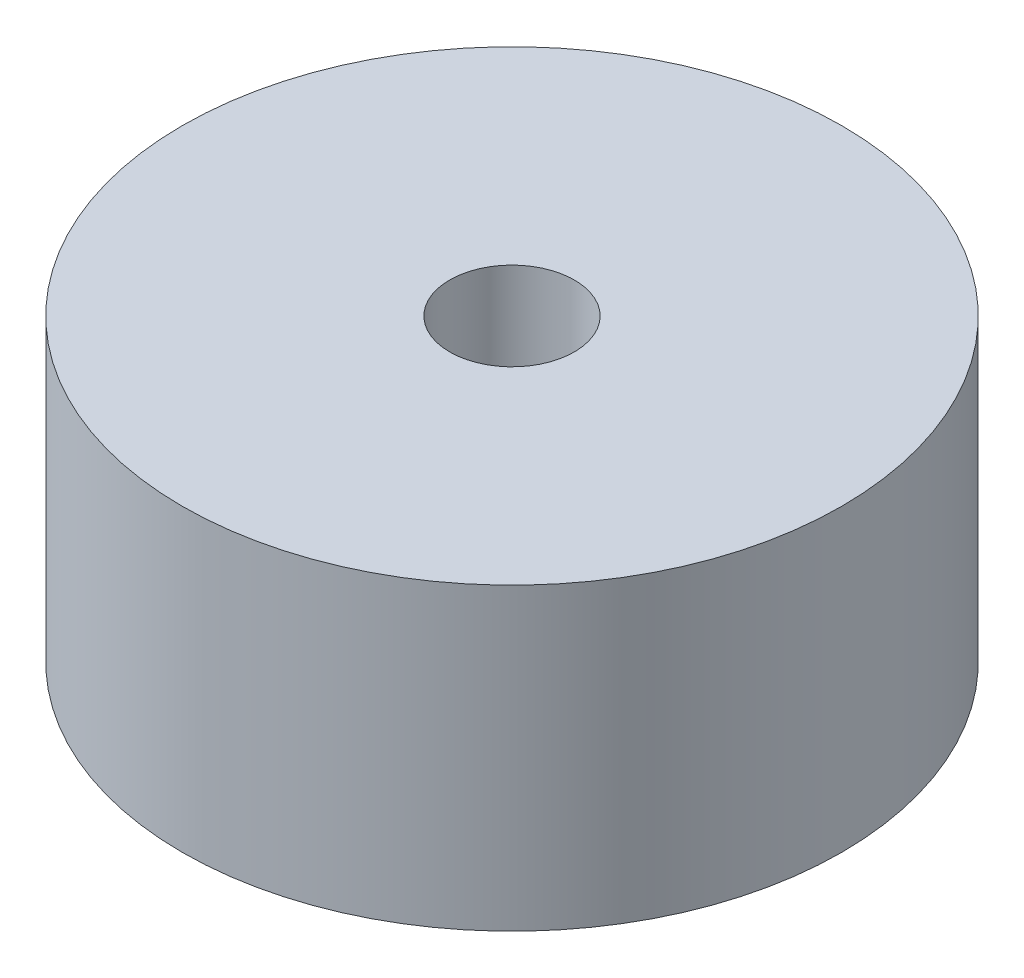
ISO-10303-21;
HEADER;
FILE_DESCRIPTION(('STEP AP214'),'2;1');
FILE_NAME('part.step','',(''),(''),'','','');
FILE_SCHEMA(('AUTOMOTIVE_DESIGN { 1 0 10303 214 1 1 1 1 }'));
ENDSEC;
DATA;
#1=APPLICATION_CONTEXT('core data for automotive mechanical design processes');
#2=APPLICATION_PROTOCOL_DEFINITION('international standard','automotive_design',2000,#1);
#3=PRODUCT_CONTEXT('',#1,'mechanical');
#4=PRODUCT('Part','Part','',(#3));
#5=PRODUCT_RELATED_PRODUCT_CATEGORY('part','',(#4));
#6=PRODUCT_DEFINITION_FORMATION('','',#4);
#7=PRODUCT_DEFINITION_CONTEXT('part definition',#1,'design');
#8=PRODUCT_DEFINITION('design','',#6,#7);
#9=PRODUCT_DEFINITION_SHAPE('','',#8);
#10=(LENGTH_UNIT() NAMED_UNIT(*) SI_UNIT(.MILLI.,.METRE.));
#11=(NAMED_UNIT(*) PLANE_ANGLE_UNIT() SI_UNIT($,.RADIAN.));
#12=(NAMED_UNIT(*) SI_UNIT($,.STERADIAN.) SOLID_ANGLE_UNIT());
#13=UNCERTAINTY_MEASURE_WITH_UNIT(LENGTH_MEASURE(1.E-05),#10,'distance_accuracy_value','');
#14=(GEOMETRIC_REPRESENTATION_CONTEXT(3) GLOBAL_UNCERTAINTY_ASSIGNED_CONTEXT((#13)) GLOBAL_UNIT_ASSIGNED_CONTEXT((#10,
#11,#12)) REPRESENTATION_CONTEXT('',''));
#15=CARTESIAN_POINT('',(0.,0.,0.));
#16=DIRECTION('',(0.,0.,1.));
#17=DIRECTION('',(1.,0.,0.));
#18=AXIS2_PLACEMENT_3D('',#15,#16,#17);
#19=CARTESIAN_POINT('',(0.,5.,0.));
#20=DIRECTION('',(0.,1.,0.));
#21=DIRECTION('',(0.,0.,1.));
#22=AXIS2_PLACEMENT_3D('',#19,#20,#21);
#23=PLANE('',#22);
#24=CARTESIAN_POINT('',(0.,5.,0.));
#25=DIRECTION('',(0.,1.,0.));
#26=DIRECTION('',(0.,0.,1.));
#27=AXIS2_PLACEMENT_3D('',#24,#25,#26);
#28=CIRCLE('',#27,5.5);
#29=CARTESIAN_POINT('',(0.,5.,5.5));
#30=VERTEX_POINT('',#29);
#31=EDGE_CURVE('E10',#30,#30,#28,.T.);
#32=ORIENTED_EDGE('',*,*,#31,.T.);
#33=EDGE_LOOP('',(#32));
#34=FACE_BOUND('',#33,.T.);
#35=CARTESIAN_POINT('',(0.,5.,0.));
#36=DIRECTION('',(0.,1.,0.));
#37=DIRECTION('',(0.,0.,1.));
#38=AXIS2_PLACEMENT_3D('',#35,#36,#37);
#39=CIRCLE('',#38,1.04);
#40=CARTESIAN_POINT('',(0.,5.,1.04));
#41=VERTEX_POINT('',#40);
#42=EDGE_CURVE('E42',#41,#41,#39,.T.);
#43=ORIENTED_EDGE('',*,*,#42,.F.);
#44=EDGE_LOOP('',(#43));
#45=FACE_BOUND('',#44,.T.);
#46=ADVANCED_FACE('F31',(#34,#45),#23,.T.);
#47=CARTESIAN_POINT('',(0.,0.,0.));
#48=DIRECTION('',(0.,1.,0.));
#49=DIRECTION('',(0.,0.,1.));
#50=AXIS2_PLACEMENT_3D('',#47,#48,#49);
#51=PLANE('',#50);
#52=CARTESIAN_POINT('',(0.,0.,0.));
#53=DIRECTION('',(0.,1.,0.));
#54=DIRECTION('',(0.,0.,1.));
#55=AXIS2_PLACEMENT_3D('',#52,#53,#54);
#56=CIRCLE('',#55,5.5);
#57=CARTESIAN_POINT('',(0.,0.,5.5));
#58=VERTEX_POINT('',#57);
#59=EDGE_CURVE('E35',#58,#58,#56,.T.);
#60=ORIENTED_EDGE('',*,*,#59,.F.);
#61=EDGE_LOOP('',(#60));
#62=FACE_BOUND('',#61,.T.);
#63=CARTESIAN_POINT('',(0.,0.,0.));
#64=DIRECTION('',(0.,1.,0.));
#65=DIRECTION('',(0.,0.,1.));
#66=AXIS2_PLACEMENT_3D('',#63,#64,#65);
#67=CIRCLE('',#66,1.04);
#68=CARTESIAN_POINT('',(0.,0.,1.04));
#69=VERTEX_POINT('',#68);
#70=EDGE_CURVE('E44',#69,#69,#67,.T.);
#71=ORIENTED_EDGE('',*,*,#70,.T.);
#72=EDGE_LOOP('',(#71));
#73=FACE_BOUND('',#72,.T.);
#74=ADVANCED_FACE('F54',(#62,#73),#51,.F.);
#75=CARTESIAN_POINT('',(0.,5.,0.));
#76=DIRECTION('',(0.,-1.,0.));
#77=DIRECTION('',(0.,0.,-1.));
#78=AXIS2_PLACEMENT_3D('',#75,#76,#77);
#79=CYLINDRICAL_SURFACE('',#78,5.5);
#80=ORIENTED_EDGE('',*,*,#31,.F.);
#81=EDGE_LOOP('',(#80));
#82=FACE_BOUND('',#81,.T.);
#83=ORIENTED_EDGE('',*,*,#59,.T.);
#84=EDGE_LOOP('',(#83));
#85=FACE_BOUND('',#84,.T.);
#86=ADVANCED_FACE('F33',(#82,#85),#79,.T.);
#87=CARTESIAN_POINT('',(0.,5.,0.));
#88=DIRECTION('',(0.,-1.,0.));
#89=DIRECTION('',(0.,0.,-1.));
#90=AXIS2_PLACEMENT_3D('',#87,#88,#89);
#91=CYLINDRICAL_SURFACE('',#90,1.04);
#92=ORIENTED_EDGE('',*,*,#42,.T.);
#93=EDGE_LOOP('',(#92));
#94=FACE_BOUND('',#93,.T.);
#95=ORIENTED_EDGE('',*,*,#70,.F.);
#96=EDGE_LOOP('',(#95));
#97=FACE_BOUND('',#96,.T.);
#98=ADVANCED_FACE('F50',(#94,#97),#91,.F.);
#99=CLOSED_SHELL('',(#46,#74,#86,#98));
#100=MANIFOLD_SOLID_BREP('B2',#99);
#101=ADVANCED_BREP_SHAPE_REPRESENTATION('',(#18,#100),#14);
#102=SHAPE_DEFINITION_REPRESENTATION(#9,#101);
ENDSEC;
END-ISO-10303-21;
